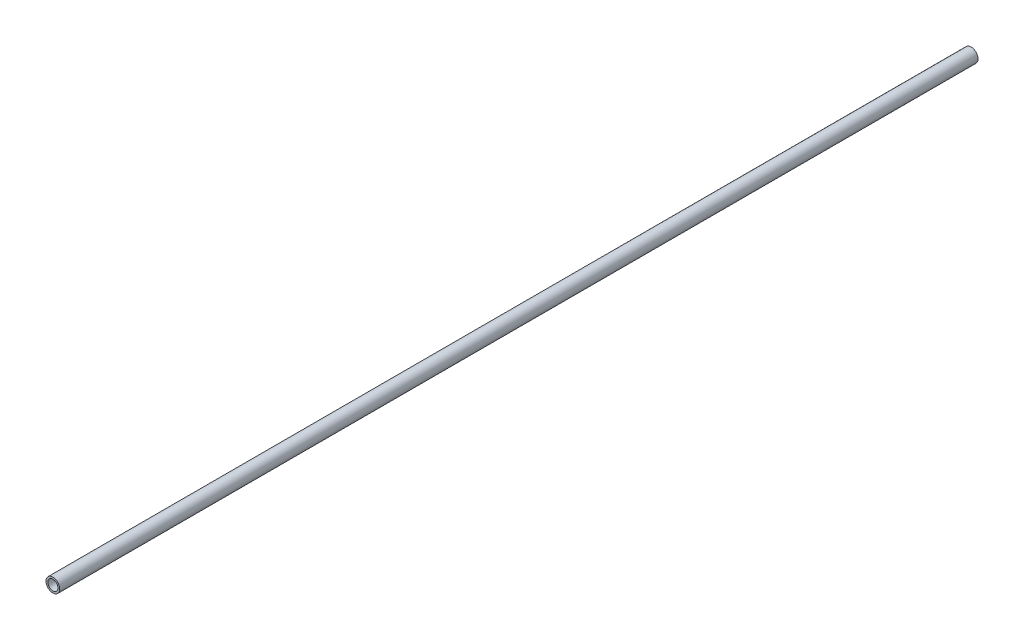
ISO-10303-21;
HEADER;
FILE_DESCRIPTION(('STEP AP214'),'2;1');
FILE_NAME('part.step','',(''),(''),'','','');
FILE_SCHEMA(('AUTOMOTIVE_DESIGN { 1 0 10303 214 1 1 1 1 }'));
ENDSEC;
DATA;
#1=APPLICATION_CONTEXT('core data for automotive mechanical design processes');
#2=APPLICATION_PROTOCOL_DEFINITION('international standard','automotive_design',2000,#1);
#3=PRODUCT_CONTEXT('',#1,'mechanical');
#4=PRODUCT('Part','Part','',(#3));
#5=PRODUCT_RELATED_PRODUCT_CATEGORY('part','',(#4));
#6=PRODUCT_DEFINITION_FORMATION('','',#4);
#7=PRODUCT_DEFINITION_CONTEXT('part definition',#1,'design');
#8=PRODUCT_DEFINITION('design','',#6,#7);
#9=PRODUCT_DEFINITION_SHAPE('','',#8);
#10=(LENGTH_UNIT() NAMED_UNIT(*) SI_UNIT(.MILLI.,.METRE.));
#11=(NAMED_UNIT(*) PLANE_ANGLE_UNIT() SI_UNIT($,.RADIAN.));
#12=(NAMED_UNIT(*) SI_UNIT($,.STERADIAN.) SOLID_ANGLE_UNIT());
#13=UNCERTAINTY_MEASURE_WITH_UNIT(LENGTH_MEASURE(1.E-05),#10,'distance_accuracy_value','');
#14=(GEOMETRIC_REPRESENTATION_CONTEXT(3) GLOBAL_UNCERTAINTY_ASSIGNED_CONTEXT((#13)) GLOBAL_UNIT_ASSIGNED_CONTEXT((#10,
#11,#12)) REPRESENTATION_CONTEXT('',''));
#15=CARTESIAN_POINT('',(0.,0.,0.));
#16=DIRECTION('',(0.,0.,1.));
#17=DIRECTION('',(1.,0.,0.));
#18=AXIS2_PLACEMENT_3D('',#15,#16,#17);
#19=CARTESIAN_POINT('',(-32.8992814964538,249.847725302664,500.));
#20=DIRECTION('',(0.,0.,1.));
#21=DIRECTION('',(1.,0.,0.));
#22=AXIS2_PLACEMENT_3D('',#19,#20,#21);
#23=PLANE('',#22);
#24=CARTESIAN_POINT('',(-32.8992814964538,249.847725302664,500.));
#25=DIRECTION('',(0.,0.,1.));
#26=DIRECTION('',(1.,0.,0.));
#27=AXIS2_PLACEMENT_3D('',#24,#25,#26);
#28=CIRCLE('',#27,3.75);
#29=CARTESIAN_POINT('',(-29.1492814964538,249.847725302664,500.));
#30=VERTEX_POINT('',#29);
#31=EDGE_CURVE('E10',#30,#30,#28,.T.);
#32=ORIENTED_EDGE('',*,*,#31,.T.);
#33=EDGE_LOOP('',(#32));
#34=FACE_BOUND('',#33,.T.);
#35=CARTESIAN_POINT('',(-32.8992814964538,249.847725302664,500.));
#36=DIRECTION('',(0.,0.,1.));
#37=DIRECTION('',(1.,0.,0.));
#38=AXIS2_PLACEMENT_3D('',#35,#36,#37);
#39=CIRCLE('',#38,2.75);
#40=CARTESIAN_POINT('',(-30.1492814964538,249.847725302664,500.));
#41=VERTEX_POINT('',#40);
#42=EDGE_CURVE('E40',#41,#41,#39,.T.);
#43=ORIENTED_EDGE('',*,*,#42,.F.);
#44=EDGE_LOOP('',(#43));
#45=FACE_BOUND('',#44,.T.);
#46=ADVANCED_FACE('F29',(#34,#45),#23,.T.);
#47=CARTESIAN_POINT('',(-32.8992814964538,249.847725302664,0.));
#48=DIRECTION('',(0.,0.,1.));
#49=DIRECTION('',(1.,0.,0.));
#50=AXIS2_PLACEMENT_3D('',#47,#48,#49);
#51=PLANE('',#50);
#52=CARTESIAN_POINT('',(-32.8992814964538,249.847725302664,0.));
#53=DIRECTION('',(0.,0.,1.));
#54=DIRECTION('',(1.,0.,0.));
#55=AXIS2_PLACEMENT_3D('',#52,#53,#54);
#56=CIRCLE('',#55,3.75);
#57=CARTESIAN_POINT('',(-29.1492814964538,249.847725302664,0.));
#58=VERTEX_POINT('',#57);
#59=EDGE_CURVE('E33',#58,#58,#56,.T.);
#60=ORIENTED_EDGE('',*,*,#59,.F.);
#61=EDGE_LOOP('',(#60));
#62=FACE_BOUND('',#61,.T.);
#63=CARTESIAN_POINT('',(-32.8992814964538,249.847725302664,0.));
#64=DIRECTION('',(0.,0.,1.));
#65=DIRECTION('',(1.,0.,0.));
#66=AXIS2_PLACEMENT_3D('',#63,#64,#65);
#67=CIRCLE('',#66,2.75);
#68=CARTESIAN_POINT('',(-30.1492814964538,249.847725302664,0.));
#69=VERTEX_POINT('',#68);
#70=EDGE_CURVE('E42',#69,#69,#67,.T.);
#71=ORIENTED_EDGE('',*,*,#70,.T.);
#72=EDGE_LOOP('',(#71));
#73=FACE_BOUND('',#72,.T.);
#74=ADVANCED_FACE('F52',(#62,#73),#51,.F.);
#75=CARTESIAN_POINT('',(-32.8992814964538,249.847725302664,500.));
#76=DIRECTION('',(0.,0.,-1.));
#77=DIRECTION('',(-1.,0.,0.));
#78=AXIS2_PLACEMENT_3D('',#75,#76,#77);
#79=CYLINDRICAL_SURFACE('',#78,3.75);
#80=ORIENTED_EDGE('',*,*,#31,.F.);
#81=EDGE_LOOP('',(#80));
#82=FACE_BOUND('',#81,.T.);
#83=ORIENTED_EDGE('',*,*,#59,.T.);
#84=EDGE_LOOP('',(#83));
#85=FACE_BOUND('',#84,.T.);
#86=ADVANCED_FACE('F31',(#82,#85),#79,.T.);
#87=CARTESIAN_POINT('',(-32.8992814964538,249.847725302664,500.));
#88=DIRECTION('',(0.,0.,-1.));
#89=DIRECTION('',(-1.,0.,0.));
#90=AXIS2_PLACEMENT_3D('',#87,#88,#89);
#91=CYLINDRICAL_SURFACE('',#90,2.75);
#92=ORIENTED_EDGE('',*,*,#42,.T.);
#93=EDGE_LOOP('',(#92));
#94=FACE_BOUND('',#93,.T.);
#95=ORIENTED_EDGE('',*,*,#70,.F.);
#96=EDGE_LOOP('',(#95));
#97=FACE_BOUND('',#96,.T.);
#98=ADVANCED_FACE('F48',(#94,#97),#91,.F.);
#99=CLOSED_SHELL('',(#46,#74,#86,#98));
#100=MANIFOLD_SOLID_BREP('B2',#99);
#101=ADVANCED_BREP_SHAPE_REPRESENTATION('',(#18,#100),#14);
#102=SHAPE_DEFINITION_REPRESENTATION(#9,#101);
ENDSEC;
END-ISO-10303-21;
